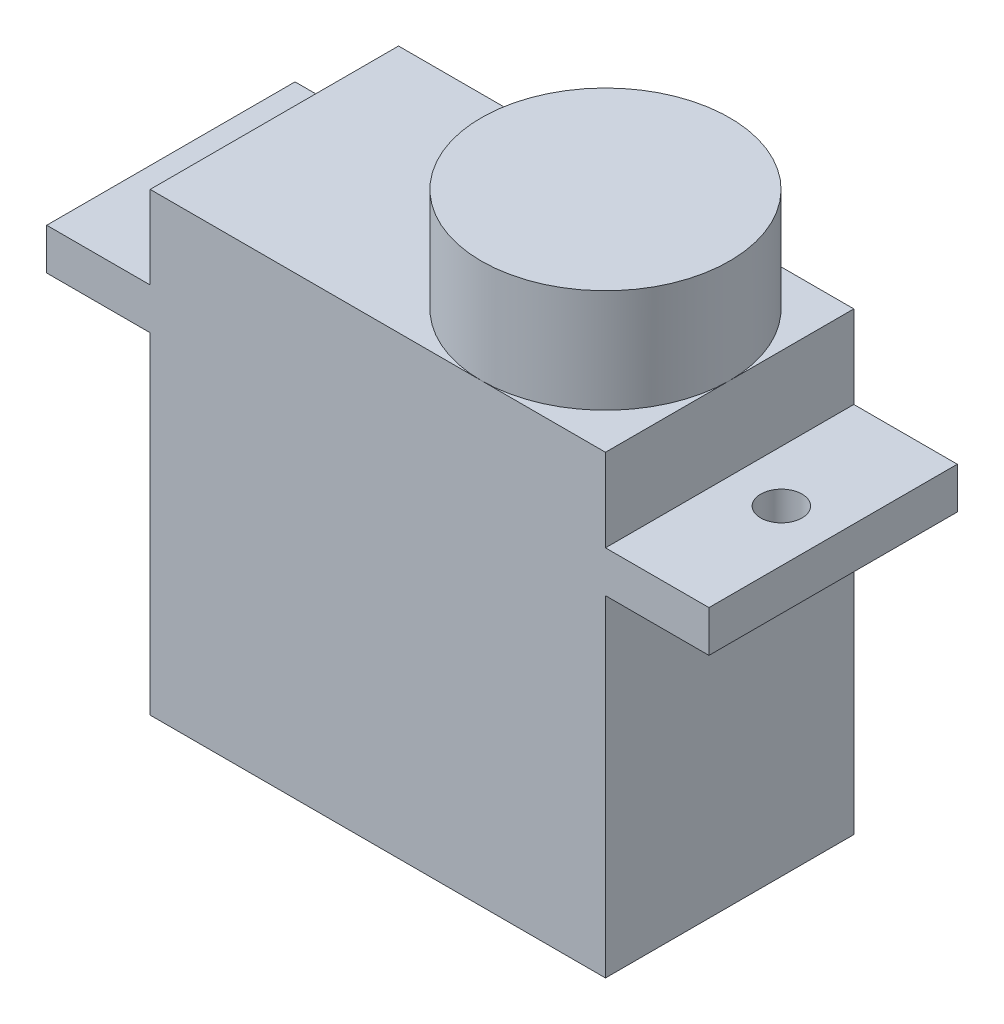
ISO-10303-21;
HEADER;
FILE_DESCRIPTION(('STEP AP214'),'2;1');
FILE_NAME('part.step','',(''),(''),'','','');
FILE_SCHEMA(('AUTOMOTIVE_DESIGN { 1 0 10303 214 1 1 1 1 }'));
ENDSEC;
DATA;
#1=APPLICATION_CONTEXT('core data for automotive mechanical design processes');
#2=APPLICATION_PROTOCOL_DEFINITION('international standard','automotive_design',2000,#1);
#3=PRODUCT_CONTEXT('',#1,'mechanical');
#4=PRODUCT('Part','Part','',(#3));
#5=PRODUCT_RELATED_PRODUCT_CATEGORY('part','',(#4));
#6=PRODUCT_DEFINITION_FORMATION('','',#4);
#7=PRODUCT_DEFINITION_CONTEXT('part definition',#1,'design');
#8=PRODUCT_DEFINITION('design','',#6,#7);
#9=PRODUCT_DEFINITION_SHAPE('','',#8);
#10=(LENGTH_UNIT() NAMED_UNIT(*) SI_UNIT(.MILLI.,.METRE.));
#11=(NAMED_UNIT(*) PLANE_ANGLE_UNIT() SI_UNIT($,.RADIAN.));
#12=(NAMED_UNIT(*) SI_UNIT($,.STERADIAN.) SOLID_ANGLE_UNIT());
#13=UNCERTAINTY_MEASURE_WITH_UNIT(LENGTH_MEASURE(1.E-05),#10,'distance_accuracy_value','');
#14=(GEOMETRIC_REPRESENTATION_CONTEXT(3) GLOBAL_UNCERTAINTY_ASSIGNED_CONTEXT((#13)) GLOBAL_UNIT_ASSIGNED_CONTEXT((#10,
#11,#12)) REPRESENTATION_CONTEXT('',''));
#15=CARTESIAN_POINT('',(0.,0.,0.));
#16=DIRECTION('',(0.,0.,1.));
#17=DIRECTION('',(1.,0.,0.));
#18=AXIS2_PLACEMENT_3D('',#15,#16,#17);
#19=CARTESIAN_POINT('',(0.,22.,-12.));
#20=DIRECTION('',(0.,-1.,0.));
#21=DIRECTION('',(0.,0.,-1.));
#22=AXIS2_PLACEMENT_3D('',#19,#20,#21);
#23=PLANE('',#22);
#24=CARTESIAN_POINT('',(16.,22.,-6.));
#25=DIRECTION('',(0.,1.,0.));
#26=DIRECTION('',(0.,0.,1.));
#27=AXIS2_PLACEMENT_3D('',#24,#25,#26);
#28=CIRCLE('',#27,6.);
#29=CARTESIAN_POINT('',(16.,22.,0.));
#30=VERTEX_POINT('',#29);
#31=CARTESIAN_POINT('',(22.,22.,-6.));
#32=VERTEX_POINT('',#31);
#33=EDGE_CURVE('E48',#30,#32,#28,.T.);
#34=ORIENTED_EDGE('',*,*,#33,.F.);
#35=DIRECTION('',(1.,0.,0.));
#36=VECTOR('',#35,1.);
#37=CARTESIAN_POINT('',(0.,22.,0.));
#38=LINE('',#37,#36);
#39=CARTESIAN_POINT('',(22.,22.,0.));
#40=VERTEX_POINT('',#39);
#41=EDGE_CURVE('E143',#30,#40,#38,.T.);
#42=ORIENTED_EDGE('',*,*,#41,.T.);
#43=DIRECTION('',(0.,0.,-1.));
#44=VECTOR('',#43,1.);
#45=CARTESIAN_POINT('',(22.,22.,0.));
#46=LINE('',#45,#44);
#47=EDGE_CURVE('E154',#40,#32,#46,.T.);
#48=ORIENTED_EDGE('',*,*,#47,.T.);
#49=EDGE_LOOP('',(#34,#42,#48));
#50=FACE_BOUND('',#49,.T.);
#51=ADVANCED_FACE('F37',(#50),#23,.F.);
#52=CARTESIAN_POINT('',(16.,22.,-12.));
#53=VERTEX_POINT('',#52);
#54=EDGE_CURVE('E11',#32,#53,#28,.T.);
#55=ORIENTED_EDGE('',*,*,#54,.F.);
#56=CARTESIAN_POINT('',(22.,22.,-12.));
#57=VERTEX_POINT('',#56);
#58=EDGE_CURVE('E142',#32,#57,#46,.T.);
#59=ORIENTED_EDGE('',*,*,#58,.T.);
#60=DIRECTION('',(-1.,0.,0.));
#61=VECTOR('',#60,1.);
#62=CARTESIAN_POINT('',(0.,22.,-12.));
#63=LINE('',#62,#61);
#64=EDGE_CURVE('E222',#57,#53,#63,.T.);
#65=ORIENTED_EDGE('',*,*,#64,.T.);
#66=EDGE_LOOP('',(#55,#59,#65));
#67=FACE_BOUND('',#66,.T.);
#68=ADVANCED_FACE('F275',(#67),#23,.F.);
#69=EDGE_CURVE('E46',#53,#30,#28,.T.);
#70=ORIENTED_EDGE('',*,*,#69,.F.);
#71=CARTESIAN_POINT('',(0.,22.,-12.));
#72=VERTEX_POINT('',#71);
#73=EDGE_CURVE('E221',#53,#72,#63,.T.);
#74=ORIENTED_EDGE('',*,*,#73,.T.);
#75=DIRECTION('',(0.,0.,1.));
#76=VECTOR('',#75,1.);
#77=CARTESIAN_POINT('',(0.,22.,0.));
#78=LINE('',#77,#76);
#79=CARTESIAN_POINT('',(0.,22.,0.));
#80=VERTEX_POINT('',#79);
#81=EDGE_CURVE('E138',#72,#80,#78,.T.);
#82=ORIENTED_EDGE('',*,*,#81,.T.);
#83=EDGE_CURVE('E134',#80,#30,#38,.T.);
#84=ORIENTED_EDGE('',*,*,#83,.T.);
#85=EDGE_LOOP('',(#70,#74,#82,#84));
#86=FACE_BOUND('',#85,.T.);
#87=ADVANCED_FACE('F136',(#86),#23,.F.);
#88=CARTESIAN_POINT('',(0.,22.,0.));
#89=DIRECTION('',(1.,0.,0.));
#90=DIRECTION('',(0.,0.,-1.));
#91=AXIS2_PLACEMENT_3D('',#88,#89,#90);
#92=PLANE('',#91);
#93=DIRECTION('',(0.,-1.,0.));
#94=VECTOR('',#93,1.);
#95=CARTESIAN_POINT('',(0.,22.,-12.));
#96=LINE('',#95,#94);
#97=CARTESIAN_POINT('',(0.,18.,-12.));
#98=VERTEX_POINT('',#97);
#99=EDGE_CURVE('E235',#72,#98,#96,.T.);
#100=ORIENTED_EDGE('',*,*,#99,.T.);
#101=DIRECTION('',(0.,0.,1.));
#102=VECTOR('',#101,1.);
#103=CARTESIAN_POINT('',(0.,18.,0.));
#104=LINE('',#103,#102);
#105=CARTESIAN_POINT('',(0.,18.,0.));
#106=VERTEX_POINT('',#105);
#107=EDGE_CURVE('E214',#98,#106,#104,.T.);
#108=ORIENTED_EDGE('',*,*,#107,.T.);
#109=DIRECTION('',(0.,-1.,0.));
#110=VECTOR('',#109,1.);
#111=CARTESIAN_POINT('',(0.,22.,0.));
#112=LINE('',#111,#110);
#113=EDGE_CURVE('E158',#80,#106,#112,.T.);
#114=ORIENTED_EDGE('',*,*,#113,.F.);
#115=ORIENTED_EDGE('',*,*,#81,.F.);
#116=EDGE_LOOP('',(#100,#108,#114,#115));
#117=FACE_BOUND('',#116,.T.);
#118=ADVANCED_FACE('F282',(#117),#92,.F.);
#119=CARTESIAN_POINT('',(22.,22.,0.));
#120=DIRECTION('',(-1.,0.,0.));
#121=DIRECTION('',(0.,0.,1.));
#122=AXIS2_PLACEMENT_3D('',#119,#120,#121);
#123=PLANE('',#122);
#124=DIRECTION('',(0.,-1.,0.));
#125=VECTOR('',#124,1.);
#126=CARTESIAN_POINT('',(22.,22.,0.));
#127=LINE('',#126,#125);
#128=CARTESIAN_POINT('',(22.,18.,0.));
#129=VERTEX_POINT('',#128);
#130=EDGE_CURVE('E149',#40,#129,#127,.T.);
#131=ORIENTED_EDGE('',*,*,#130,.T.);
#132=DIRECTION('',(0.,0.,-1.));
#133=VECTOR('',#132,1.);
#134=CARTESIAN_POINT('',(22.,18.,0.));
#135=LINE('',#134,#133);
#136=CARTESIAN_POINT('',(22.,18.,-12.));
#137=VERTEX_POINT('',#136);
#138=EDGE_CURVE('E212',#129,#137,#135,.T.);
#139=ORIENTED_EDGE('',*,*,#138,.T.);
#140=DIRECTION('',(0.,-1.,0.));
#141=VECTOR('',#140,1.);
#142=CARTESIAN_POINT('',(22.,22.,-12.));
#143=LINE('',#142,#141);
#144=EDGE_CURVE('E239',#57,#137,#143,.T.);
#145=ORIENTED_EDGE('',*,*,#144,.F.);
#146=ORIENTED_EDGE('',*,*,#58,.F.);
#147=ORIENTED_EDGE('',*,*,#47,.F.);
#148=EDGE_LOOP('',(#131,#139,#145,#146,#147));
#149=FACE_BOUND('',#148,.T.);
#150=ADVANCED_FACE('F272',(#149),#123,.F.);
#151=CARTESIAN_POINT('',(0.,16.,0.));
#152=VERTEX_POINT('',#151);
#153=CARTESIAN_POINT('',(0.,0.,0.));
#154=VERTEX_POINT('',#153);
#155=EDGE_CURVE('E159',#152,#154,#112,.T.);
#156=ORIENTED_EDGE('',*,*,#155,.F.);
#157=DIRECTION('',(0.,0.,-1.));
#158=VECTOR('',#157,1.);
#159=CARTESIAN_POINT('',(0.,16.,0.));
#160=LINE('',#159,#158);
#161=CARTESIAN_POINT('',(0.,16.,-12.));
#162=VERTEX_POINT('',#161);
#163=EDGE_CURVE('E209',#152,#162,#160,.T.);
#164=ORIENTED_EDGE('',*,*,#163,.T.);
#165=CARTESIAN_POINT('',(0.,0.,-12.));
#166=VERTEX_POINT('',#165);
#167=EDGE_CURVE('E224',#162,#166,#96,.T.);
#168=ORIENTED_EDGE('',*,*,#167,.T.);
#169=DIRECTION('',(0.,0.,1.));
#170=VECTOR('',#169,1.);
#171=CARTESIAN_POINT('',(0.,0.,0.));
#172=LINE('',#171,#170);
#173=EDGE_CURVE('E217',#166,#154,#172,.T.);
#174=ORIENTED_EDGE('',*,*,#173,.T.);
#175=EDGE_LOOP('',(#156,#164,#168,#174));
#176=FACE_BOUND('',#175,.T.);
#177=ADVANCED_FACE('F39',(#176),#92,.F.);
#178=CARTESIAN_POINT('',(0.,22.,0.));
#179=DIRECTION('',(0.,0.,-1.));
#180=DIRECTION('',(-1.,0.,0.));
#181=AXIS2_PLACEMENT_3D('',#178,#179,#180);
#182=PLANE('',#181);
#183=CARTESIAN_POINT('',(22.,16.,0.));
#184=VERTEX_POINT('',#183);
#185=CARTESIAN_POINT('',(22.,0.,0.));
#186=VERTEX_POINT('',#185);
#187=EDGE_CURVE('E242',#184,#186,#127,.T.);
#188=ORIENTED_EDGE('',*,*,#187,.F.);
#189=DIRECTION('',(1.,0.,0.));
#190=VECTOR('',#189,1.);
#191=CARTESIAN_POINT('',(-5.,16.,0.));
#192=LINE('',#191,#190);
#193=CARTESIAN_POINT('',(27.,16.,0.));
#194=VERTEX_POINT('',#193);
#195=EDGE_CURVE('E189',#184,#194,#192,.T.);
#196=ORIENTED_EDGE('',*,*,#195,.T.);
#197=DIRECTION('',(0.,1.,0.));
#198=VECTOR('',#197,1.);
#199=CARTESIAN_POINT('',(27.,18.,0.));
#200=LINE('',#199,#198);
#201=CARTESIAN_POINT('',(27.,18.,0.));
#202=VERTEX_POINT('',#201);
#203=EDGE_CURVE('E192',#194,#202,#200,.T.);
#204=ORIENTED_EDGE('',*,*,#203,.T.);
#205=DIRECTION('',(-1.,0.,0.));
#206=VECTOR('',#205,1.);
#207=CARTESIAN_POINT('',(-5.,18.,0.));
#208=LINE('',#207,#206);
#209=EDGE_CURVE('E175',#202,#129,#208,.T.);
#210=ORIENTED_EDGE('',*,*,#209,.T.);
#211=ORIENTED_EDGE('',*,*,#130,.F.);
#212=ORIENTED_EDGE('',*,*,#41,.F.);
#213=ORIENTED_EDGE('',*,*,#83,.F.);
#214=ORIENTED_EDGE('',*,*,#113,.T.);
#215=CARTESIAN_POINT('',(-5.,18.,0.));
#216=VERTEX_POINT('',#215);
#217=EDGE_CURVE('E195',#106,#216,#208,.T.);
#218=ORIENTED_EDGE('',*,*,#217,.T.);
#219=DIRECTION('',(0.,-1.,0.));
#220=VECTOR('',#219,1.);
#221=CARTESIAN_POINT('',(-5.,18.,0.));
#222=LINE('',#221,#220);
#223=CARTESIAN_POINT('',(-5.,16.,0.));
#224=VERTEX_POINT('',#223);
#225=EDGE_CURVE('E186',#216,#224,#222,.T.);
#226=ORIENTED_EDGE('',*,*,#225,.T.);
#227=EDGE_CURVE('E190',#224,#152,#192,.T.);
#228=ORIENTED_EDGE('',*,*,#227,.T.);
#229=ORIENTED_EDGE('',*,*,#155,.T.);
#230=DIRECTION('',(1.,0.,0.));
#231=VECTOR('',#230,1.);
#232=CARTESIAN_POINT('',(0.,0.,0.));
#233=LINE('',#232,#231);
#234=EDGE_CURVE('E227',#154,#186,#233,.T.);
#235=ORIENTED_EDGE('',*,*,#234,.T.);
#236=EDGE_LOOP('',(#188,#196,#204,#210,#211,#212,#213,#214,#218,#226,#228,#229,#235));
#237=FACE_BOUND('',#236,.T.);
#238=ADVANCED_FACE('F147',(#237),#182,.F.);
#239=CARTESIAN_POINT('',(22.,16.,-12.));
#240=VERTEX_POINT('',#239);
#241=CARTESIAN_POINT('',(22.,0.,-12.));
#242=VERTEX_POINT('',#241);
#243=EDGE_CURVE('E238',#240,#242,#143,.T.);
#244=ORIENTED_EDGE('',*,*,#243,.F.);
#245=DIRECTION('',(0.,0.,1.));
#246=VECTOR('',#245,1.);
#247=CARTESIAN_POINT('',(22.,16.,0.));
#248=LINE('',#247,#246);
#249=EDGE_CURVE('E200',#240,#184,#248,.T.);
#250=ORIENTED_EDGE('',*,*,#249,.T.);
#251=ORIENTED_EDGE('',*,*,#187,.T.);
#252=DIRECTION('',(0.,0.,-1.));
#253=VECTOR('',#252,1.);
#254=CARTESIAN_POINT('',(22.,0.,0.));
#255=LINE('',#254,#253);
#256=EDGE_CURVE('E230',#186,#242,#255,.T.);
#257=ORIENTED_EDGE('',*,*,#256,.T.);
#258=EDGE_LOOP('',(#244,#250,#251,#257));
#259=FACE_BOUND('',#258,.T.);
#260=ADVANCED_FACE('F246',(#259),#123,.F.);
#261=CARTESIAN_POINT('',(0.,22.,-12.));
#262=DIRECTION('',(0.,0.,1.));
#263=DIRECTION('',(1.,0.,0.));
#264=AXIS2_PLACEMENT_3D('',#261,#262,#263);
#265=PLANE('',#264);
#266=ORIENTED_EDGE('',*,*,#167,.F.);
#267=DIRECTION('',(1.,0.,0.));
#268=VECTOR('',#267,1.);
#269=CARTESIAN_POINT('',(-5.,16.,-12.));
#270=LINE('',#269,#268);
#271=CARTESIAN_POINT('',(-5.,16.,-12.));
#272=VERTEX_POINT('',#271);
#273=EDGE_CURVE('E176',#272,#162,#270,.T.);
#274=ORIENTED_EDGE('',*,*,#273,.F.);
#275=DIRECTION('',(0.,-1.,0.));
#276=VECTOR('',#275,1.);
#277=CARTESIAN_POINT('',(-5.,18.,-12.));
#278=LINE('',#277,#276);
#279=CARTESIAN_POINT('',(-5.,18.,-12.));
#280=VERTEX_POINT('',#279);
#281=EDGE_CURVE('E171',#280,#272,#278,.T.);
#282=ORIENTED_EDGE('',*,*,#281,.F.);
#283=DIRECTION('',(-1.,0.,0.));
#284=VECTOR('',#283,1.);
#285=CARTESIAN_POINT('',(-5.,18.,-12.));
#286=LINE('',#285,#284);
#287=EDGE_CURVE('E181',#98,#280,#286,.T.);
#288=ORIENTED_EDGE('',*,*,#287,.F.);
#289=ORIENTED_EDGE('',*,*,#99,.F.);
#290=ORIENTED_EDGE('',*,*,#73,.F.);
#291=ORIENTED_EDGE('',*,*,#64,.F.);
#292=ORIENTED_EDGE('',*,*,#144,.T.);
#293=CARTESIAN_POINT('',(27.,18.,-12.));
#294=VERTEX_POINT('',#293);
#295=EDGE_CURVE('E182',#294,#137,#286,.T.);
#296=ORIENTED_EDGE('',*,*,#295,.F.);
#297=DIRECTION('',(0.,1.,0.));
#298=VECTOR('',#297,1.);
#299=CARTESIAN_POINT('',(27.,18.,-12.));
#300=LINE('',#299,#298);
#301=CARTESIAN_POINT('',(27.,16.,-12.));
#302=VERTEX_POINT('',#301);
#303=EDGE_CURVE('E178',#302,#294,#300,.T.);
#304=ORIENTED_EDGE('',*,*,#303,.F.);
#305=EDGE_CURVE('E174',#240,#302,#270,.T.);
#306=ORIENTED_EDGE('',*,*,#305,.F.);
#307=ORIENTED_EDGE('',*,*,#243,.T.);
#308=DIRECTION('',(-1.,0.,0.));
#309=VECTOR('',#308,1.);
#310=CARTESIAN_POINT('',(0.,0.,-12.));
#311=LINE('',#310,#309);
#312=EDGE_CURVE('E218',#242,#166,#311,.T.);
#313=ORIENTED_EDGE('',*,*,#312,.T.);
#314=EDGE_LOOP('',(#266,#274,#282,#288,#289,#290,#291,#292,#296,#304,#306,#307,#313));
#315=FACE_BOUND('',#314,.T.);
#316=ADVANCED_FACE('F258',(#315),#265,.F.);
#317=CARTESIAN_POINT('',(0.,0.,-12.));
#318=DIRECTION('',(0.,-1.,0.));
#319=DIRECTION('',(0.,0.,-1.));
#320=AXIS2_PLACEMENT_3D('',#317,#318,#319);
#321=PLANE('',#320);
#322=ORIENTED_EDGE('',*,*,#173,.F.);
#323=ORIENTED_EDGE('',*,*,#312,.F.);
#324=ORIENTED_EDGE('',*,*,#256,.F.);
#325=ORIENTED_EDGE('',*,*,#234,.F.);
#326=EDGE_LOOP('',(#322,#323,#324,#325));
#327=FACE_BOUND('',#326,.T.);
#328=ADVANCED_FACE('F255',(#327),#321,.T.);
#329=CARTESIAN_POINT('',(27.,18.,-12.));
#330=DIRECTION('',(1.,0.,0.));
#331=DIRECTION('',(0.,1.,0.));
#332=AXIS2_PLACEMENT_3D('',#329,#330,#331);
#333=PLANE('',#332);
#334=ORIENTED_EDGE('',*,*,#203,.F.);
#335=DIRECTION('',(0.,0.,1.));
#336=VECTOR('',#335,1.);
#337=CARTESIAN_POINT('',(27.,16.,-12.));
#338=LINE('',#337,#336);
#339=EDGE_CURVE('E203',#302,#194,#338,.T.);
#340=ORIENTED_EDGE('',*,*,#339,.F.);
#341=ORIENTED_EDGE('',*,*,#303,.T.);
#342=DIRECTION('',(0.,0.,1.));
#343=VECTOR('',#342,1.);
#344=CARTESIAN_POINT('',(27.,18.,-12.));
#345=LINE('',#344,#343);
#346=EDGE_CURVE('E201',#294,#202,#345,.T.);
#347=ORIENTED_EDGE('',*,*,#346,.T.);
#348=EDGE_LOOP('',(#334,#340,#341,#347));
#349=FACE_BOUND('',#348,.T.);
#350=ADVANCED_FACE('F289',(#349),#333,.T.);
#351=CARTESIAN_POINT('',(-5.,16.,-12.));
#352=DIRECTION('',(0.,-1.,0.));
#353=DIRECTION('',(1.,0.,0.));
#354=AXIS2_PLACEMENT_3D('',#351,#352,#353);
#355=PLANE('',#354);
#356=CARTESIAN_POINT('',(24.5,16.,-6.));
#357=DIRECTION('',(0.,-1.,0.));
#358=DIRECTION('',(1.,0.,0.));
#359=AXIS2_PLACEMENT_3D('',#356,#357,#358);
#360=CIRCLE('',#359,1.);
#361=CARTESIAN_POINT('',(25.5,16.,-6.));
#362=VERTEX_POINT('',#361);
#363=EDGE_CURVE('E165',#362,#362,#360,.T.);
#364=ORIENTED_EDGE('',*,*,#363,.F.);
#365=EDGE_LOOP('',(#364));
#366=FACE_BOUND('',#365,.T.);
#367=ORIENTED_EDGE('',*,*,#249,.F.);
#368=ORIENTED_EDGE('',*,*,#305,.T.);
#369=ORIENTED_EDGE('',*,*,#339,.T.);
#370=ORIENTED_EDGE('',*,*,#195,.F.);
#371=EDGE_LOOP('',(#367,#368,#369,#370));
#372=FACE_BOUND('',#371,.T.);
#373=ADVANCED_FACE('F263',(#366,#372),#355,.T.);
#374=CARTESIAN_POINT('',(-5.,18.,-12.));
#375=DIRECTION('',(0.,1.,0.));
#376=DIRECTION('',(0.,0.,1.));
#377=AXIS2_PLACEMENT_3D('',#374,#375,#376);
#378=PLANE('',#377);
#379=CARTESIAN_POINT('',(24.5,18.,-6.));
#380=DIRECTION('',(0.,1.,0.));
#381=DIRECTION('',(0.,0.,1.));
#382=AXIS2_PLACEMENT_3D('',#379,#380,#381);
#383=CIRCLE('',#382,1.);
#384=CARTESIAN_POINT('',(24.5,18.,-5.));
#385=VERTEX_POINT('',#384);
#386=EDGE_CURVE('E162',#385,#385,#383,.T.);
#387=ORIENTED_EDGE('',*,*,#386,.F.);
#388=EDGE_LOOP('',(#387));
#389=FACE_BOUND('',#388,.T.);
#390=ORIENTED_EDGE('',*,*,#138,.F.);
#391=ORIENTED_EDGE('',*,*,#209,.F.);
#392=ORIENTED_EDGE('',*,*,#346,.F.);
#393=ORIENTED_EDGE('',*,*,#295,.T.);
#394=EDGE_LOOP('',(#390,#391,#392,#393));
#395=FACE_BOUND('',#394,.T.);
#396=ADVANCED_FACE('F269',(#389,#395),#378,.T.);
#397=CARTESIAN_POINT('',(-2.5,18.,-6.));
#398=DIRECTION('',(0.,1.,0.));
#399=DIRECTION('',(0.,0.,1.));
#400=AXIS2_PLACEMENT_3D('',#397,#398,#399);
#401=CIRCLE('',#400,1.);
#402=CARTESIAN_POINT('',(-2.5,18.,-5.));
#403=VERTEX_POINT('',#402);
#404=EDGE_CURVE('E168',#403,#403,#401,.T.);
#405=ORIENTED_EDGE('',*,*,#404,.F.);
#406=EDGE_LOOP('',(#405));
#407=FACE_BOUND('',#406,.T.);
#408=ORIENTED_EDGE('',*,*,#107,.F.);
#409=ORIENTED_EDGE('',*,*,#287,.T.);
#410=DIRECTION('',(0.,0.,1.));
#411=VECTOR('',#410,1.);
#412=CARTESIAN_POINT('',(-5.,18.,-12.));
#413=LINE('',#412,#411);
#414=EDGE_CURVE('E197',#280,#216,#413,.T.);
#415=ORIENTED_EDGE('',*,*,#414,.T.);
#416=ORIENTED_EDGE('',*,*,#217,.F.);
#417=EDGE_LOOP('',(#408,#409,#415,#416));
#418=FACE_BOUND('',#417,.T.);
#419=ADVANCED_FACE('F309',(#407,#418),#378,.T.);
#420=CARTESIAN_POINT('',(-2.5,16.,-6.));
#421=DIRECTION('',(0.,-1.,0.));
#422=DIRECTION('',(1.,0.,0.));
#423=AXIS2_PLACEMENT_3D('',#420,#421,#422);
#424=CIRCLE('',#423,1.);
#425=CARTESIAN_POINT('',(-1.5,16.,-6.));
#426=VERTEX_POINT('',#425);
#427=EDGE_CURVE('E41',#426,#426,#424,.T.);
#428=ORIENTED_EDGE('',*,*,#427,.F.);
#429=EDGE_LOOP('',(#428));
#430=FACE_BOUND('',#429,.T.);
#431=ORIENTED_EDGE('',*,*,#163,.F.);
#432=ORIENTED_EDGE('',*,*,#227,.F.);
#433=DIRECTION('',(0.,0.,1.));
#434=VECTOR('',#433,1.);
#435=CARTESIAN_POINT('',(-5.,16.,-12.));
#436=LINE('',#435,#434);
#437=EDGE_CURVE('E185',#272,#224,#436,.T.);
#438=ORIENTED_EDGE('',*,*,#437,.F.);
#439=ORIENTED_EDGE('',*,*,#273,.T.);
#440=EDGE_LOOP('',(#431,#432,#438,#439));
#441=FACE_BOUND('',#440,.T.);
#442=ADVANCED_FACE('F315',(#430,#441),#355,.T.);
#443=CARTESIAN_POINT('',(-5.,18.,-12.));
#444=DIRECTION('',(-1.,0.,0.));
#445=DIRECTION('',(0.,0.,1.));
#446=AXIS2_PLACEMENT_3D('',#443,#444,#445);
#447=PLANE('',#446);
#448=ORIENTED_EDGE('',*,*,#225,.F.);
#449=ORIENTED_EDGE('',*,*,#414,.F.);
#450=ORIENTED_EDGE('',*,*,#281,.T.);
#451=ORIENTED_EDGE('',*,*,#437,.T.);
#452=EDGE_LOOP('',(#448,#449,#450,#451));
#453=FACE_BOUND('',#452,.T.);
#454=ADVANCED_FACE('F285',(#453),#447,.T.);
#455=CARTESIAN_POINT('',(-2.5,-4.,-6.));
#456=DIRECTION('',(0.,1.,0.));
#457=DIRECTION('',(0.,0.,1.));
#458=AXIS2_PLACEMENT_3D('',#455,#456,#457);
#459=CYLINDRICAL_SURFACE('',#458,1.);
#460=ORIENTED_EDGE('',*,*,#427,.T.);
#461=EDGE_LOOP('',(#460));
#462=FACE_BOUND('',#461,.T.);
#463=ORIENTED_EDGE('',*,*,#404,.T.);
#464=EDGE_LOOP('',(#463));
#465=FACE_BOUND('',#464,.T.);
#466=ADVANCED_FACE('F322',(#462,#465),#459,.F.);
#467=CARTESIAN_POINT('',(24.5,-4.,-6.));
#468=DIRECTION('',(0.,1.,0.));
#469=DIRECTION('',(0.,0.,1.));
#470=AXIS2_PLACEMENT_3D('',#467,#468,#469);
#471=CYLINDRICAL_SURFACE('',#470,1.);
#472=ORIENTED_EDGE('',*,*,#363,.T.);
#473=EDGE_LOOP('',(#472));
#474=FACE_BOUND('',#473,.T.);
#475=ORIENTED_EDGE('',*,*,#386,.T.);
#476=EDGE_LOOP('',(#475));
#477=FACE_BOUND('',#476,.T.);
#478=ADVANCED_FACE('F336',(#474,#477),#471,.F.);
#479=CARTESIAN_POINT('',(16.,27.,-6.));
#480=DIRECTION('',(0.,-1.,0.));
#481=DIRECTION('',(0.,0.,-1.));
#482=AXIS2_PLACEMENT_3D('',#479,#480,#481);
#483=CYLINDRICAL_SURFACE('',#482,6.);
#484=CARTESIAN_POINT('',(16.,27.,-6.));
#485=DIRECTION('',(0.,1.,0.));
#486=DIRECTION('',(0.,0.,1.));
#487=AXIS2_PLACEMENT_3D('',#484,#485,#486);
#488=CIRCLE('',#487,6.);
#489=CARTESIAN_POINT('',(16.,27.,0.));
#490=VERTEX_POINT('',#489);
#491=EDGE_CURVE('E156',#490,#490,#488,.T.);
#492=ORIENTED_EDGE('',*,*,#491,.F.);
#493=EDGE_LOOP('',(#492));
#494=FACE_BOUND('',#493,.T.);
#495=ORIENTED_EDGE('',*,*,#33,.T.);
#496=ORIENTED_EDGE('',*,*,#54,.T.);
#497=ORIENTED_EDGE('',*,*,#69,.T.);
#498=EDGE_LOOP('',(#495,#496,#497));
#499=FACE_BOUND('',#498,.T.);
#500=ADVANCED_FACE('F157',(#494,#499),#483,.T.);
#501=CARTESIAN_POINT('',(16.,27.,-6.));
#502=DIRECTION('',(0.,1.,0.));
#503=DIRECTION('',(0.,0.,1.));
#504=AXIS2_PLACEMENT_3D('',#501,#502,#503);
#505=PLANE('',#504);
#506=ORIENTED_EDGE('',*,*,#491,.T.);
#507=EDGE_LOOP('',(#506));
#508=FACE_BOUND('',#507,.T.);
#509=ADVANCED_FACE('F345',(#508),#505,.T.);
#510=CLOSED_SHELL('',(#51,#68,#87,#118,#150,#177,#238,#260,#316,#328,#350,#373,#396,#419,#442,
#454,#466,#478,#500,#509));
#511=MANIFOLD_SOLID_BREP('B2',#510);
#512=ADVANCED_BREP_SHAPE_REPRESENTATION('',(#18,#511),#14);
#513=SHAPE_DEFINITION_REPRESENTATION(#9,#512);
ENDSEC;
END-ISO-10303-21;
